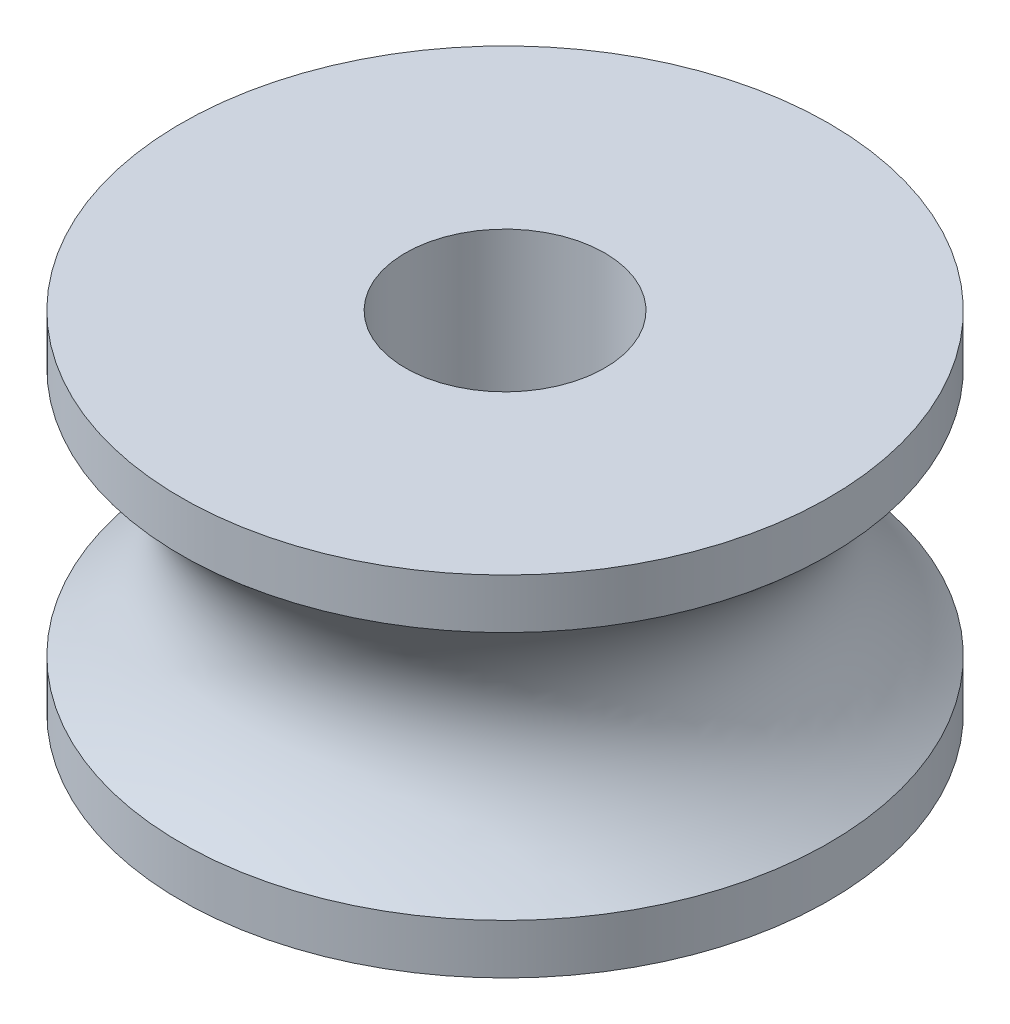
ISO-10303-21;
HEADER;
FILE_DESCRIPTION(('STEP AP214'),'2;1');
FILE_NAME('part.step','',(''),(''),'','','');
FILE_SCHEMA(('AUTOMOTIVE_DESIGN { 1 0 10303 214 1 1 1 1 }'));
ENDSEC;
DATA;
#1=APPLICATION_CONTEXT('core data for automotive mechanical design processes');
#2=APPLICATION_PROTOCOL_DEFINITION('international standard','automotive_design',2000,#1);
#3=PRODUCT_CONTEXT('',#1,'mechanical');
#4=PRODUCT('Part','Part','',(#3));
#5=PRODUCT_RELATED_PRODUCT_CATEGORY('part','',(#4));
#6=PRODUCT_DEFINITION_FORMATION('','',#4);
#7=PRODUCT_DEFINITION_CONTEXT('part definition',#1,'design');
#8=PRODUCT_DEFINITION('design','',#6,#7);
#9=PRODUCT_DEFINITION_SHAPE('','',#8);
#10=(LENGTH_UNIT() NAMED_UNIT(*) SI_UNIT(.MILLI.,.METRE.));
#11=(NAMED_UNIT(*) PLANE_ANGLE_UNIT() SI_UNIT($,.RADIAN.));
#12=(NAMED_UNIT(*) SI_UNIT($,.STERADIAN.) SOLID_ANGLE_UNIT());
#13=UNCERTAINTY_MEASURE_WITH_UNIT(LENGTH_MEASURE(1.E-05),#10,'distance_accuracy_value','');
#14=(GEOMETRIC_REPRESENTATION_CONTEXT(3) GLOBAL_UNCERTAINTY_ASSIGNED_CONTEXT((#13)) GLOBAL_UNIT_ASSIGNED_CONTEXT((#10,
#11,#12)) REPRESENTATION_CONTEXT('',''));
#15=CARTESIAN_POINT('',(0.,0.,0.));
#16=DIRECTION('',(0.,0.,1.));
#17=DIRECTION('',(1.,0.,0.));
#18=AXIS2_PLACEMENT_3D('',#15,#16,#17);
#19=CARTESIAN_POINT('',(6.5,6.,0.));
#20=CARTESIAN_POINT('',(3.5,3.5,0.));
#21=CARTESIAN_POINT('',(6.5,1.,0.));
#22=B_SPLINE_CURVE_WITH_KNOTS('',2,(#19,#20,#21),.UNSPECIFIED.,.F.,.F.,(3,3),(0.,1.),.UNSPECIFIED.);
#23=CARTESIAN_POINT('',(0.,0.,0.));
#24=DIRECTION('',(0.,-1.,0.));
#25=AXIS1_PLACEMENT('',#23,#24);
#26=SURFACE_OF_REVOLUTION('',#22,#25);
#27=CARTESIAN_POINT('',(0.,1.,0.));
#28=DIRECTION('',(0.,-1.,0.));
#29=DIRECTION('',(0.,0.,-1.));
#30=AXIS2_PLACEMENT_3D('',#27,#28,#29);
#31=CIRCLE('',#30,6.5);
#32=CARTESIAN_POINT('',(0.,1.,-6.5));
#33=VERTEX_POINT('',#32);
#34=EDGE_CURVE('E47',#33,#33,#31,.T.);
#35=ORIENTED_EDGE('',*,*,#34,.F.);
#36=EDGE_LOOP('',(#35));
#37=FACE_BOUND('',#36,.T.);
#38=CARTESIAN_POINT('',(0.,6.,0.));
#39=DIRECTION('',(0.,-1.,0.));
#40=DIRECTION('',(0.,0.,-1.));
#41=AXIS2_PLACEMENT_3D('',#38,#39,#40);
#42=CIRCLE('',#41,6.5);
#43=CARTESIAN_POINT('',(0.,6.,-6.5));
#44=VERTEX_POINT('',#43);
#45=EDGE_CURVE('E10',#44,#44,#42,.T.);
#46=ORIENTED_EDGE('',*,*,#45,.T.);
#47=EDGE_LOOP('',(#46));
#48=FACE_BOUND('',#47,.T.);
#49=ADVANCED_FACE('F32',(#37,#48),#26,.T.);
#50=CARTESIAN_POINT('',(0.,0.,0.));
#51=DIRECTION('',(0.,-1.,0.));
#52=DIRECTION('',(0.,0.,-1.));
#53=AXIS2_PLACEMENT_3D('',#50,#51,#52);
#54=CYLINDRICAL_SURFACE('',#53,6.5);
#55=ORIENTED_EDGE('',*,*,#45,.F.);
#56=EDGE_LOOP('',(#55));
#57=FACE_BOUND('',#56,.T.);
#58=CARTESIAN_POINT('',(0.,7.,0.));
#59=DIRECTION('',(0.,-1.,0.));
#60=DIRECTION('',(0.,0.,-1.));
#61=AXIS2_PLACEMENT_3D('',#58,#59,#60);
#62=CIRCLE('',#61,6.5);
#63=CARTESIAN_POINT('',(0.,7.,-6.5));
#64=VERTEX_POINT('',#63);
#65=EDGE_CURVE('E39',#64,#64,#62,.T.);
#66=ORIENTED_EDGE('',*,*,#65,.T.);
#67=EDGE_LOOP('',(#66));
#68=FACE_BOUND('',#67,.T.);
#69=ADVANCED_FACE('F84',(#57,#68),#54,.T.);
#70=CARTESIAN_POINT('',(0.,7.,0.));
#71=DIRECTION('',(0.,-1.,0.));
#72=DIRECTION('',(0.,0.,-1.));
#73=AXIS2_PLACEMENT_3D('',#70,#71,#72);
#74=PLANE('',#73);
#75=CARTESIAN_POINT('',(0.,7.,0.));
#76=DIRECTION('',(0.,-1.,0.));
#77=DIRECTION('',(0.,0.,-1.));
#78=AXIS2_PLACEMENT_3D('',#75,#76,#77);
#79=CIRCLE('',#78,2.);
#80=CARTESIAN_POINT('',(0.,7.,-2.));
#81=VERTEX_POINT('',#80);
#82=EDGE_CURVE('E51',#81,#81,#79,.T.);
#83=ORIENTED_EDGE('',*,*,#82,.T.);
#84=EDGE_LOOP('',(#83));
#85=FACE_BOUND('',#84,.T.);
#86=ORIENTED_EDGE('',*,*,#65,.F.);
#87=EDGE_LOOP('',(#86));
#88=FACE_BOUND('',#87,.T.);
#89=ADVANCED_FACE('F72',(#85,#88),#74,.F.);
#90=CARTESIAN_POINT('',(0.,0.,0.));
#91=DIRECTION('',(0.,-1.,0.));
#92=DIRECTION('',(0.,0.,-1.));
#93=AXIS2_PLACEMENT_3D('',#90,#91,#92);
#94=PLANE('',#93);
#95=CARTESIAN_POINT('',(0.,0.,0.));
#96=DIRECTION('',(0.,-1.,0.));
#97=DIRECTION('',(0.,0.,-1.));
#98=AXIS2_PLACEMENT_3D('',#95,#96,#97);
#99=CIRCLE('',#98,2.);
#100=CARTESIAN_POINT('',(0.,0.,-2.));
#101=VERTEX_POINT('',#100);
#102=EDGE_CURVE('E61',#101,#101,#99,.T.);
#103=ORIENTED_EDGE('',*,*,#102,.F.);
#104=EDGE_LOOP('',(#103));
#105=FACE_BOUND('',#104,.T.);
#106=CARTESIAN_POINT('',(0.,0.,0.));
#107=DIRECTION('',(0.,-1.,0.));
#108=DIRECTION('',(0.,0.,-1.));
#109=AXIS2_PLACEMENT_3D('',#106,#107,#108);
#110=CIRCLE('',#109,6.5);
#111=CARTESIAN_POINT('',(0.,0.,-6.5));
#112=VERTEX_POINT('',#111);
#113=EDGE_CURVE('E43',#112,#112,#110,.T.);
#114=ORIENTED_EDGE('',*,*,#113,.T.);
#115=EDGE_LOOP('',(#114));
#116=FACE_BOUND('',#115,.T.);
#117=ADVANCED_FACE('F68',(#105,#116),#94,.T.);
#118=CARTESIAN_POINT('',(0.,0.,0.));
#119=DIRECTION('',(0.,-1.,0.));
#120=DIRECTION('',(0.,0.,-1.));
#121=AXIS2_PLACEMENT_3D('',#118,#119,#120);
#122=CYLINDRICAL_SURFACE('',#121,6.5);
#123=ORIENTED_EDGE('',*,*,#34,.T.);
#124=EDGE_LOOP('',(#123));
#125=FACE_BOUND('',#124,.T.);
#126=ORIENTED_EDGE('',*,*,#113,.F.);
#127=EDGE_LOOP('',(#126));
#128=FACE_BOUND('',#127,.T.);
#129=ADVANCED_FACE('F71',(#125,#128),#122,.T.);
#130=CARTESIAN_POINT('',(0.,10.,0.));
#131=DIRECTION('',(0.,-1.,0.));
#132=DIRECTION('',(0.,0.,-1.));
#133=AXIS2_PLACEMENT_3D('',#130,#131,#132);
#134=CYLINDRICAL_SURFACE('',#133,2.);
#135=ORIENTED_EDGE('',*,*,#102,.T.);
#136=EDGE_LOOP('',(#135));
#137=FACE_BOUND('',#136,.T.);
#138=ORIENTED_EDGE('',*,*,#82,.F.);
#139=EDGE_LOOP('',(#138));
#140=FACE_BOUND('',#139,.T.);
#141=ADVANCED_FACE('F65',(#137,#140),#134,.F.);
#142=CLOSED_SHELL('',(#49,#69,#89,#117,#129,#141));
#143=MANIFOLD_SOLID_BREP('B2',#142);
#144=ADVANCED_BREP_SHAPE_REPRESENTATION('',(#18,#143),#14);
#145=SHAPE_DEFINITION_REPRESENTATION(#9,#144);
ENDSEC;
END-ISO-10303-21;
